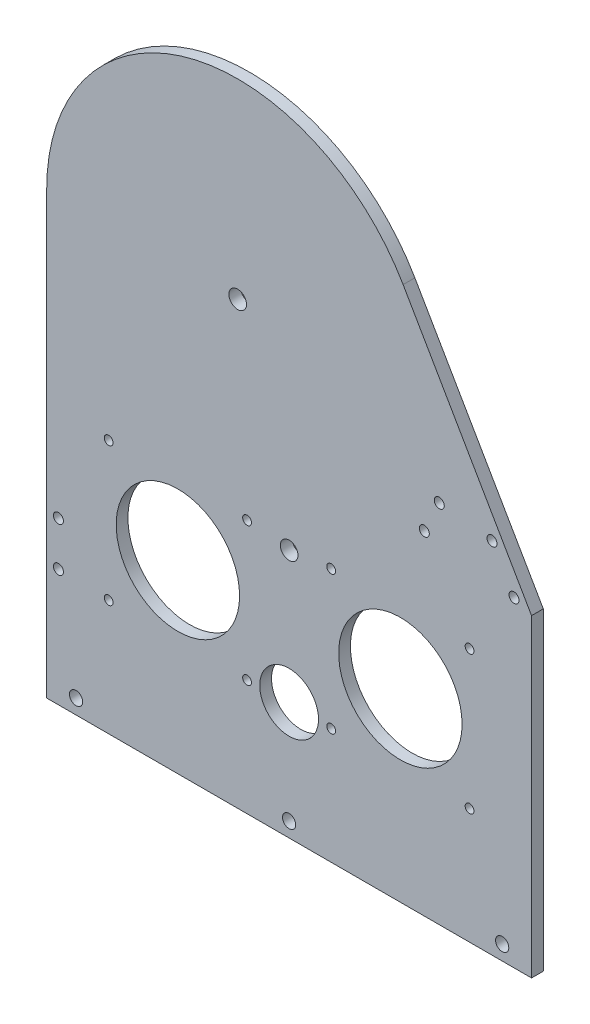
ISO-10303-21;
HEADER;
FILE_DESCRIPTION(('STEP AP214'),'2;1');
FILE_NAME('part.step','',(''),(''),'','','');
FILE_SCHEMA(('AUTOMOTIVE_DESIGN { 1 0 10303 214 1 1 1 1 }'));
ENDSEC;
DATA;
#1=APPLICATION_CONTEXT('core data for automotive mechanical design processes');
#2=APPLICATION_PROTOCOL_DEFINITION('international standard','automotive_design',2000,#1);
#3=PRODUCT_CONTEXT('',#1,'mechanical');
#4=PRODUCT('Part','Part','',(#3));
#5=PRODUCT_RELATED_PRODUCT_CATEGORY('part','',(#4));
#6=PRODUCT_DEFINITION_FORMATION('','',#4);
#7=PRODUCT_DEFINITION_CONTEXT('part definition',#1,'design');
#8=PRODUCT_DEFINITION('design','',#6,#7);
#9=PRODUCT_DEFINITION_SHAPE('','',#8);
#10=(LENGTH_UNIT() NAMED_UNIT(*) SI_UNIT(.MILLI.,.METRE.));
#11=(NAMED_UNIT(*) PLANE_ANGLE_UNIT() SI_UNIT($,.RADIAN.));
#12=(NAMED_UNIT(*) SI_UNIT($,.STERADIAN.) SOLID_ANGLE_UNIT());
#13=UNCERTAINTY_MEASURE_WITH_UNIT(LENGTH_MEASURE(1.E-05),#10,'distance_accuracy_value','');
#14=(GEOMETRIC_REPRESENTATION_CONTEXT(3) GLOBAL_UNCERTAINTY_ASSIGNED_CONTEXT((#13)) GLOBAL_UNIT_ASSIGNED_CONTEXT((#10,
#11,#12)) REPRESENTATION_CONTEXT('',''));
#15=CARTESIAN_POINT('',(0.,0.,0.));
#16=DIRECTION('',(0.,0.,1.));
#17=DIRECTION('',(1.,0.,0.));
#18=AXIS2_PLACEMENT_3D('',#15,#16,#17);
#19=CARTESIAN_POINT('',(65.,150.,4.));
#20=DIRECTION('',(0.,0.,1.));
#21=DIRECTION('',(1.,0.,0.));
#22=AXIS2_PLACEMENT_3D('',#19,#20,#21);
#23=PLANE('',#22);
#24=CARTESIAN_POINT('',(143.91,39.4079759479735,4.0000000000191));
#25=DIRECTION('',(0.,0.,1.));
#26=DIRECTION('',(1.,0.,0.));
#27=AXIS2_PLACEMENT_3D('',#24,#25,#26);
#28=CIRCLE('',#27,1.5);
#29=CARTESIAN_POINT('',(145.41,39.4079759479735,4.0000000000191));
#30=VERTEX_POINT('',#29);
#31=EDGE_CURVE('E437',#30,#30,#28,.T.);
#32=ORIENTED_EDGE('',*,*,#31,.F.);
#33=EDGE_LOOP('',(#32));
#34=FACE_BOUND('',#33,.T.);
#35=CARTESIAN_POINT('',(143.91,86.5079759479735,4.0000000000191));
#36=DIRECTION('',(0.,0.,1.));
#37=DIRECTION('',(1.,0.,0.));
#38=AXIS2_PLACEMENT_3D('',#35,#36,#37);
#39=CIRCLE('',#38,1.5);
#40=CARTESIAN_POINT('',(145.41,86.5079759479735,4.0000000000191));
#41=VERTEX_POINT('',#40);
#42=EDGE_CURVE('E439',#41,#41,#39,.T.);
#43=ORIENTED_EDGE('',*,*,#42,.F.);
#44=EDGE_LOOP('',(#43));
#45=FACE_BOUND('',#44,.T.);
#46=CARTESIAN_POINT('',(96.81,39.4079759479735,4.0000000000191));
#47=DIRECTION('',(0.,0.,1.));
#48=DIRECTION('',(1.,0.,0.));
#49=AXIS2_PLACEMENT_3D('',#46,#47,#48);
#50=CIRCLE('',#49,1.5);
#51=CARTESIAN_POINT('',(98.31,39.4079759479735,4.0000000000191));
#52=VERTEX_POINT('',#51);
#53=EDGE_CURVE('E447',#52,#52,#50,.T.);
#54=ORIENTED_EDGE('',*,*,#53,.F.);
#55=EDGE_LOOP('',(#54));
#56=FACE_BOUND('',#55,.T.);
#57=CARTESIAN_POINT('',(96.81,86.5079759479735,4.0000000000191));
#58=DIRECTION('',(0.,0.,1.));
#59=DIRECTION('',(1.,0.,0.));
#60=AXIS2_PLACEMENT_3D('',#57,#58,#59);
#61=CIRCLE('',#60,1.5);
#62=CARTESIAN_POINT('',(98.31,86.5079759479735,4.0000000000191));
#63=VERTEX_POINT('',#62);
#64=EDGE_CURVE('E453',#63,#63,#61,.T.);
#65=ORIENTED_EDGE('',*,*,#64,.F.);
#66=EDGE_LOOP('',(#65));
#67=FACE_BOUND('',#66,.T.);
#68=CARTESIAN_POINT('',(68.19,39.4079759479735,4.));
#69=DIRECTION('',(0.,0.,1.));
#70=DIRECTION('',(1.,0.,0.));
#71=AXIS2_PLACEMENT_3D('',#68,#69,#70);
#72=CIRCLE('',#71,1.5);
#73=CARTESIAN_POINT('',(69.69,39.4079759479735,4.));
#74=VERTEX_POINT('',#73);
#75=EDGE_CURVE('E459',#74,#74,#72,.T.);
#76=ORIENTED_EDGE('',*,*,#75,.F.);
#77=EDGE_LOOP('',(#76));
#78=FACE_BOUND('',#77,.T.);
#79=CARTESIAN_POINT('',(21.09,39.4079759479735,4.));
#80=DIRECTION('',(0.,0.,1.));
#81=DIRECTION('',(1.,0.,0.));
#82=AXIS2_PLACEMENT_3D('',#79,#80,#81);
#83=CIRCLE('',#82,1.5);
#84=CARTESIAN_POINT('',(22.59,39.4079759479735,4.));
#85=VERTEX_POINT('',#84);
#86=EDGE_CURVE('E465',#85,#85,#83,.T.);
#87=ORIENTED_EDGE('',*,*,#86,.F.);
#88=EDGE_LOOP('',(#87));
#89=FACE_BOUND('',#88,.T.);
#90=CARTESIAN_POINT('',(68.19,86.5079759479735,4.));
#91=DIRECTION('',(0.,0.,1.));
#92=DIRECTION('',(1.,0.,0.));
#93=AXIS2_PLACEMENT_3D('',#90,#91,#92);
#94=CIRCLE('',#93,1.5);
#95=CARTESIAN_POINT('',(69.69,86.5079759479735,4.));
#96=VERTEX_POINT('',#95);
#97=EDGE_CURVE('E471',#96,#96,#94,.T.);
#98=ORIENTED_EDGE('',*,*,#97,.F.);
#99=EDGE_LOOP('',(#98));
#100=FACE_BOUND('',#99,.T.);
#101=CARTESIAN_POINT('',(21.09,86.5079759479735,4.));
#102=DIRECTION('',(0.,0.,1.));
#103=DIRECTION('',(1.,0.,0.));
#104=AXIS2_PLACEMENT_3D('',#101,#102,#103);
#105=CIRCLE('',#104,1.5);
#106=CARTESIAN_POINT('',(22.59,86.5079759479735,4.));
#107=VERTEX_POINT('',#106);
#108=EDGE_CURVE('E477',#107,#107,#105,.T.);
#109=ORIENTED_EDGE('',*,*,#108,.F.);
#110=EDGE_LOOP('',(#109));
#111=FACE_BOUND('',#110,.T.);
#112=CARTESIAN_POINT('',(128.5,113.5,4.));
#113=DIRECTION('',(0.,0.,1.));
#114=DIRECTION('',(1.,0.,0.));
#115=AXIS2_PLACEMENT_3D('',#112,#113,#114);
#116=CIRCLE('',#115,1.70000000000001);
#117=CARTESIAN_POINT('',(130.2,113.5,4.));
#118=VERTEX_POINT('',#117);
#119=EDGE_CURVE('E170',#118,#118,#116,.T.);
#120=ORIENTED_EDGE('',*,*,#119,.F.);
#121=EDGE_LOOP('',(#120));
#122=FACE_BOUND('',#121,.T.);
#123=CARTESIAN_POINT('',(151.537549630851,122.112567276853,4.));
#124=DIRECTION('',(0.,0.,1.));
#125=DIRECTION('',(1.,0.,0.));
#126=AXIS2_PLACEMENT_3D('',#123,#124,#125);
#127=CIRCLE('',#126,1.70000000000001);
#128=CARTESIAN_POINT('',(153.237549630851,122.112567276853,4.));
#129=VERTEX_POINT('',#128);
#130=EDGE_CURVE('E186',#129,#129,#127,.T.);
#131=ORIENTED_EDGE('',*,*,#130,.F.);
#132=EDGE_LOOP('',(#131));
#133=FACE_BOUND('',#132,.T.);
#134=CARTESIAN_POINT('',(44.64,62.9579759479735,4.));
#135=DIRECTION('',(0.,0.,1.));
#136=DIRECTION('',(1.,0.,0.));
#137=AXIS2_PLACEMENT_3D('',#134,#135,#136);
#138=CIRCLE('',#137,21.);
#139=CARTESIAN_POINT('',(65.64,62.9579759479735,4.));
#140=VERTEX_POINT('',#139);
#141=EDGE_CURVE('E196',#140,#140,#138,.T.);
#142=ORIENTED_EDGE('',*,*,#141,.F.);
#143=EDGE_LOOP('',(#142));
#144=FACE_BOUND('',#143,.T.);
#145=CARTESIAN_POINT('',(4.,55.,4.));
#146=DIRECTION('',(0.,0.,1.));
#147=DIRECTION('',(1.,0.,0.));
#148=AXIS2_PLACEMENT_3D('',#145,#146,#147);
#149=CIRCLE('',#148,1.7);
#150=CARTESIAN_POINT('',(5.7,55.,4.));
#151=VERTEX_POINT('',#150);
#152=EDGE_CURVE('E206',#151,#151,#149,.T.);
#153=ORIENTED_EDGE('',*,*,#152,.F.);
#154=EDGE_LOOP('',(#153));
#155=FACE_BOUND('',#154,.T.);
#156=CARTESIAN_POINT('',(155.,5.,4.));
#157=DIRECTION('',(0.,0.,1.));
#158=DIRECTION('',(1.,0.,0.));
#159=AXIS2_PLACEMENT_3D('',#156,#157,#158);
#160=CIRCLE('',#159,2.25000000000001);
#161=CARTESIAN_POINT('',(157.25,5.,4.));
#162=VERTEX_POINT('',#161);
#163=EDGE_CURVE('E216',#162,#162,#160,.T.);
#164=ORIENTED_EDGE('',*,*,#163,.F.);
#165=EDGE_LOOP('',(#164));
#166=FACE_BOUND('',#165,.T.);
#167=CARTESIAN_POINT('',(82.5,5.,4.));
#168=DIRECTION('',(0.,0.,1.));
#169=DIRECTION('',(1.,0.,0.));
#170=AXIS2_PLACEMENT_3D('',#167,#168,#169);
#171=CIRCLE('',#170,2.25);
#172=CARTESIAN_POINT('',(84.75,5.,4.));
#173=VERTEX_POINT('',#172);
#174=EDGE_CURVE('E226',#173,#173,#171,.T.);
#175=ORIENTED_EDGE('',*,*,#174,.F.);
#176=EDGE_LOOP('',(#175));
#177=FACE_BOUND('',#176,.T.);
#178=CARTESIAN_POINT('',(65.,150.,4.));
#179=DIRECTION('',(0.,0.,1.));
#180=DIRECTION('',(1.,0.,0.));
#181=AXIS2_PLACEMENT_3D('',#178,#179,#180);
#182=CIRCLE('',#181,3.00000000000001);
#183=CARTESIAN_POINT('',(68.,150.,4.));
#184=VERTEX_POINT('',#183);
#185=EDGE_CURVE('E101',#184,#184,#182,.T.);
#186=ORIENTED_EDGE('',*,*,#185,.F.);
#187=EDGE_LOOP('',(#186));
#188=FACE_BOUND('',#187,.T.);
#189=DIRECTION('',(0.,1.,0.));
#190=VECTOR('',#189,1.);
#191=CARTESIAN_POINT('',(0.,0.,4.));
#192=LINE('',#191,#190);
#193=CARTESIAN_POINT('',(0.,0.,4.));
#194=VERTEX_POINT('',#193);
#195=CARTESIAN_POINT('',(0.,150.,4.));
#196=VERTEX_POINT('',#195);
#197=EDGE_CURVE('E84',#194,#196,#192,.T.);
#198=ORIENTED_EDGE('',*,*,#197,.F.);
#199=DIRECTION('',(1.,0.,0.));
#200=VECTOR('',#199,1.);
#201=CARTESIAN_POINT('',(0.,0.,4.));
#202=LINE('',#201,#200);
#203=CARTESIAN_POINT('',(165.,0.,4.));
#204=VERTEX_POINT('',#203);
#205=EDGE_CURVE('E57',#194,#204,#202,.T.);
#206=ORIENTED_EDGE('',*,*,#205,.T.);
#207=DIRECTION('',(0.,1.,0.));
#208=VECTOR('',#207,1.);
#209=CARTESIAN_POINT('',(165.,0.,4.));
#210=LINE('',#209,#208);
#211=CARTESIAN_POINT('',(165.,106.794919243111,4.));
#212=VERTEX_POINT('',#211);
#213=EDGE_CURVE('E119',#204,#212,#210,.T.);
#214=ORIENTED_EDGE('',*,*,#213,.T.);
#215=DIRECTION('',(0.499999999999995,-0.866025403784441,0.));
#216=VECTOR('',#215,1.);
#217=CARTESIAN_POINT('',(121.291651245989,182.5,4.));
#218=LINE('',#217,#216);
#219=CARTESIAN_POINT('',(121.291651245989,182.5,4.));
#220=VERTEX_POINT('',#219);
#221=EDGE_CURVE('E116',#220,#212,#218,.T.);
#222=ORIENTED_EDGE('',*,*,#221,.F.);
#223=CARTESIAN_POINT('',(65.,150.,4.));
#224=DIRECTION('',(0.,0.,1.));
#225=DIRECTION('',(1.,0.,0.));
#226=AXIS2_PLACEMENT_3D('',#223,#224,#225);
#227=CIRCLE('',#226,65.);
#228=EDGE_CURVE('E114',#220,#196,#227,.T.);
#229=ORIENTED_EDGE('',*,*,#228,.T.);
#230=EDGE_LOOP('',(#198,#206,#214,#222,#229));
#231=FACE_BOUND('',#230,.T.);
#232=CARTESIAN_POINT('',(82.5,40.,4.));
#233=DIRECTION('',(0.,0.,1.));
#234=DIRECTION('',(1.,0.,0.));
#235=AXIS2_PLACEMENT_3D('',#232,#233,#234);
#236=CIRCLE('',#235,9.99999999999999);
#237=CARTESIAN_POINT('',(92.5,40.,4.));
#238=VERTEX_POINT('',#237);
#239=EDGE_CURVE('E141',#238,#238,#236,.T.);
#240=ORIENTED_EDGE('',*,*,#239,.F.);
#241=EDGE_LOOP('',(#240));
#242=FACE_BOUND('',#241,.T.);
#243=CARTESIAN_POINT('',(9.99999999999999,5.,4.));
#244=DIRECTION('',(0.,0.,1.));
#245=DIRECTION('',(1.,0.,0.));
#246=AXIS2_PLACEMENT_3D('',#243,#244,#245);
#247=CIRCLE('',#246,2.25);
#248=CARTESIAN_POINT('',(12.25,5.,4.));
#249=VERTEX_POINT('',#248);
#250=EDGE_CURVE('E145',#249,#249,#247,.T.);
#251=ORIENTED_EDGE('',*,*,#250,.F.);
#252=EDGE_LOOP('',(#251));
#253=FACE_BOUND('',#252,.T.);
#254=CARTESIAN_POINT('',(4.,40.,4.));
#255=DIRECTION('',(0.,0.,1.));
#256=DIRECTION('',(1.,0.,0.));
#257=AXIS2_PLACEMENT_3D('',#254,#255,#256);
#258=CIRCLE('',#257,1.7);
#259=CARTESIAN_POINT('',(5.7,40.,4.));
#260=VERTEX_POINT('',#259);
#261=EDGE_CURVE('E149',#260,#260,#258,.T.);
#262=ORIENTED_EDGE('',*,*,#261,.F.);
#263=EDGE_LOOP('',(#262));
#264=FACE_BOUND('',#263,.T.);
#265=CARTESIAN_POINT('',(82.5,84.8079759479735,4.));
#266=DIRECTION('',(0.,0.,1.));
#267=DIRECTION('',(1.,0.,0.));
#268=AXIS2_PLACEMENT_3D('',#265,#266,#267);
#269=CIRCLE('',#268,3.00000000000001);
#270=CARTESIAN_POINT('',(85.5,84.8079759479735,4.));
#271=VERTEX_POINT('',#270);
#272=EDGE_CURVE('E153',#271,#271,#269,.T.);
#273=ORIENTED_EDGE('',*,*,#272,.F.);
#274=EDGE_LOOP('',(#273));
#275=FACE_BOUND('',#274,.T.);
#276=CARTESIAN_POINT('',(120.36,62.9579759479735,4.));
#277=DIRECTION('',(0.,0.,1.));
#278=DIRECTION('',(1.,0.,0.));
#279=AXIS2_PLACEMENT_3D('',#276,#277,#278);
#280=CIRCLE('',#279,21.);
#281=CARTESIAN_POINT('',(141.36,62.9579759479735,4.));
#282=VERTEX_POINT('',#281);
#283=EDGE_CURVE('E157',#282,#282,#280,.T.);
#284=ORIENTED_EDGE('',*,*,#283,.F.);
#285=EDGE_LOOP('',(#284));
#286=FACE_BOUND('',#285,.T.);
#287=CARTESIAN_POINT('',(159.037549630851,109.122186220086,4.));
#288=DIRECTION('',(0.,0.,1.));
#289=DIRECTION('',(1.,0.,0.));
#290=AXIS2_PLACEMENT_3D('',#287,#288,#289);
#291=CIRCLE('',#290,1.70000000000001);
#292=CARTESIAN_POINT('',(160.737549630851,109.122186220086,4.));
#293=VERTEX_POINT('',#292);
#294=EDGE_CURVE('E161',#293,#293,#291,.T.);
#295=ORIENTED_EDGE('',*,*,#294,.F.);
#296=EDGE_LOOP('',(#295));
#297=FACE_BOUND('',#296,.T.);
#298=CARTESIAN_POINT('',(133.6,124.3,4.));
#299=DIRECTION('',(0.,0.,1.));
#300=DIRECTION('',(1.,0.,0.));
#301=AXIS2_PLACEMENT_3D('',#298,#299,#300);
#302=CIRCLE('',#301,1.70000000000001);
#303=CARTESIAN_POINT('',(135.3,124.3,4.));
#304=VERTEX_POINT('',#303);
#305=EDGE_CURVE('E164',#304,#304,#302,.T.);
#306=ORIENTED_EDGE('',*,*,#305,.F.);
#307=EDGE_LOOP('',(#306));
#308=FACE_BOUND('',#307,.T.);
#309=ADVANCED_FACE('F35',(#34,#45,#56,#67,#78,#89,#100,#111,#122,#133,#144,#155,#166,#177,#188,
#231,#242,#253,#264,#275,#286,#297,#308),#23,.T.);
#310=CARTESIAN_POINT('',(65.,150.,0.));
#311=DIRECTION('',(0.,0.,1.));
#312=DIRECTION('',(1.,0.,0.));
#313=AXIS2_PLACEMENT_3D('',#310,#311,#312);
#314=PLANE('',#313);
#315=CARTESIAN_POINT('',(143.91,39.4079759479735,0.));
#316=DIRECTION('',(0.,0.,1.));
#317=DIRECTION('',(1.,0.,0.));
#318=AXIS2_PLACEMENT_3D('',#315,#316,#317);
#319=CIRCLE('',#318,1.5);
#320=CARTESIAN_POINT('',(145.41,39.4079759479735,0.));
#321=VERTEX_POINT('',#320);
#322=EDGE_CURVE('E434',#321,#321,#319,.T.);
#323=ORIENTED_EDGE('',*,*,#322,.T.);
#324=EDGE_LOOP('',(#323));
#325=FACE_BOUND('',#324,.T.);
#326=CARTESIAN_POINT('',(143.91,86.5079759479735,0.));
#327=DIRECTION('',(0.,0.,1.));
#328=DIRECTION('',(1.,0.,0.));
#329=AXIS2_PLACEMENT_3D('',#326,#327,#328);
#330=CIRCLE('',#329,1.5);
#331=CARTESIAN_POINT('',(145.41,86.5079759479735,0.));
#332=VERTEX_POINT('',#331);
#333=EDGE_CURVE('E444',#332,#332,#330,.T.);
#334=ORIENTED_EDGE('',*,*,#333,.T.);
#335=EDGE_LOOP('',(#334));
#336=FACE_BOUND('',#335,.T.);
#337=CARTESIAN_POINT('',(96.81,39.4079759479735,0.));
#338=DIRECTION('',(0.,0.,1.));
#339=DIRECTION('',(1.,0.,0.));
#340=AXIS2_PLACEMENT_3D('',#337,#338,#339);
#341=CIRCLE('',#340,1.5);
#342=CARTESIAN_POINT('',(98.31,39.4079759479735,0.));
#343=VERTEX_POINT('',#342);
#344=EDGE_CURVE('E450',#343,#343,#341,.T.);
#345=ORIENTED_EDGE('',*,*,#344,.T.);
#346=EDGE_LOOP('',(#345));
#347=FACE_BOUND('',#346,.T.);
#348=CARTESIAN_POINT('',(96.81,86.5079759479735,0.));
#349=DIRECTION('',(0.,0.,1.));
#350=DIRECTION('',(1.,0.,0.));
#351=AXIS2_PLACEMENT_3D('',#348,#349,#350);
#352=CIRCLE('',#351,1.5);
#353=CARTESIAN_POINT('',(98.31,86.5079759479735,0.));
#354=VERTEX_POINT('',#353);
#355=EDGE_CURVE('E456',#354,#354,#352,.T.);
#356=ORIENTED_EDGE('',*,*,#355,.T.);
#357=EDGE_LOOP('',(#356));
#358=FACE_BOUND('',#357,.T.);
#359=CARTESIAN_POINT('',(68.19,39.4079759479735,0.));
#360=DIRECTION('',(0.,0.,1.));
#361=DIRECTION('',(1.,0.,0.));
#362=AXIS2_PLACEMENT_3D('',#359,#360,#361);
#363=CIRCLE('',#362,1.5);
#364=CARTESIAN_POINT('',(69.69,39.4079759479735,0.));
#365=VERTEX_POINT('',#364);
#366=EDGE_CURVE('E462',#365,#365,#363,.T.);
#367=ORIENTED_EDGE('',*,*,#366,.T.);
#368=EDGE_LOOP('',(#367));
#369=FACE_BOUND('',#368,.T.);
#370=CARTESIAN_POINT('',(21.09,39.4079759479735,0.));
#371=DIRECTION('',(0.,0.,1.));
#372=DIRECTION('',(1.,0.,0.));
#373=AXIS2_PLACEMENT_3D('',#370,#371,#372);
#374=CIRCLE('',#373,1.5);
#375=CARTESIAN_POINT('',(22.59,39.4079759479735,0.));
#376=VERTEX_POINT('',#375);
#377=EDGE_CURVE('E468',#376,#376,#374,.T.);
#378=ORIENTED_EDGE('',*,*,#377,.T.);
#379=EDGE_LOOP('',(#378));
#380=FACE_BOUND('',#379,.T.);
#381=CARTESIAN_POINT('',(68.19,86.5079759479735,0.));
#382=DIRECTION('',(0.,0.,1.));
#383=DIRECTION('',(1.,0.,0.));
#384=AXIS2_PLACEMENT_3D('',#381,#382,#383);
#385=CIRCLE('',#384,1.5);
#386=CARTESIAN_POINT('',(69.69,86.5079759479735,0.));
#387=VERTEX_POINT('',#386);
#388=EDGE_CURVE('E474',#387,#387,#385,.T.);
#389=ORIENTED_EDGE('',*,*,#388,.T.);
#390=EDGE_LOOP('',(#389));
#391=FACE_BOUND('',#390,.T.);
#392=CARTESIAN_POINT('',(21.09,86.5079759479735,0.));
#393=DIRECTION('',(0.,0.,1.));
#394=DIRECTION('',(1.,0.,0.));
#395=AXIS2_PLACEMENT_3D('',#392,#393,#394);
#396=CIRCLE('',#395,1.5);
#397=CARTESIAN_POINT('',(22.59,86.5079759479735,0.));
#398=VERTEX_POINT('',#397);
#399=EDGE_CURVE('E173',#398,#398,#396,.T.);
#400=ORIENTED_EDGE('',*,*,#399,.T.);
#401=EDGE_LOOP('',(#400));
#402=FACE_BOUND('',#401,.T.);
#403=CARTESIAN_POINT('',(128.5,113.5,0.));
#404=DIRECTION('',(0.,0.,1.));
#405=DIRECTION('',(1.,0.,0.));
#406=AXIS2_PLACEMENT_3D('',#403,#404,#405);
#407=CIRCLE('',#406,1.70000000000001);
#408=CARTESIAN_POINT('',(130.2,113.5,0.));
#409=VERTEX_POINT('',#408);
#410=EDGE_CURVE('E166',#409,#409,#407,.T.);
#411=ORIENTED_EDGE('',*,*,#410,.T.);
#412=EDGE_LOOP('',(#411));
#413=FACE_BOUND('',#412,.T.);
#414=CARTESIAN_POINT('',(151.537549630851,122.112567276853,0.));
#415=DIRECTION('',(0.,0.,1.));
#416=DIRECTION('',(1.,0.,0.));
#417=AXIS2_PLACEMENT_3D('',#414,#415,#416);
#418=CIRCLE('',#417,1.70000000000001);
#419=CARTESIAN_POINT('',(153.237549630851,122.112567276853,0.));
#420=VERTEX_POINT('',#419);
#421=EDGE_CURVE('E183',#420,#420,#418,.T.);
#422=ORIENTED_EDGE('',*,*,#421,.T.);
#423=EDGE_LOOP('',(#422));
#424=FACE_BOUND('',#423,.T.);
#425=CARTESIAN_POINT('',(44.64,62.9579759479735,0.));
#426=DIRECTION('',(0.,0.,1.));
#427=DIRECTION('',(1.,0.,0.));
#428=AXIS2_PLACEMENT_3D('',#425,#426,#427);
#429=CIRCLE('',#428,21.);
#430=CARTESIAN_POINT('',(65.64,62.9579759479735,0.));
#431=VERTEX_POINT('',#430);
#432=EDGE_CURVE('E193',#431,#431,#429,.T.);
#433=ORIENTED_EDGE('',*,*,#432,.T.);
#434=EDGE_LOOP('',(#433));
#435=FACE_BOUND('',#434,.T.);
#436=CARTESIAN_POINT('',(4.,55.,0.));
#437=DIRECTION('',(0.,0.,1.));
#438=DIRECTION('',(1.,0.,0.));
#439=AXIS2_PLACEMENT_3D('',#436,#437,#438);
#440=CIRCLE('',#439,1.7);
#441=CARTESIAN_POINT('',(5.7,55.,0.));
#442=VERTEX_POINT('',#441);
#443=EDGE_CURVE('E203',#442,#442,#440,.T.);
#444=ORIENTED_EDGE('',*,*,#443,.T.);
#445=EDGE_LOOP('',(#444));
#446=FACE_BOUND('',#445,.T.);
#447=CARTESIAN_POINT('',(155.,5.,0.));
#448=DIRECTION('',(0.,0.,1.));
#449=DIRECTION('',(1.,0.,0.));
#450=AXIS2_PLACEMENT_3D('',#447,#448,#449);
#451=CIRCLE('',#450,2.25000000000001);
#452=CARTESIAN_POINT('',(157.25,5.,0.));
#453=VERTEX_POINT('',#452);
#454=EDGE_CURVE('E213',#453,#453,#451,.T.);
#455=ORIENTED_EDGE('',*,*,#454,.T.);
#456=EDGE_LOOP('',(#455));
#457=FACE_BOUND('',#456,.T.);
#458=CARTESIAN_POINT('',(82.5,5.,0.));
#459=DIRECTION('',(0.,0.,1.));
#460=DIRECTION('',(1.,0.,0.));
#461=AXIS2_PLACEMENT_3D('',#458,#459,#460);
#462=CIRCLE('',#461,2.25);
#463=CARTESIAN_POINT('',(84.75,5.,0.));
#464=VERTEX_POINT('',#463);
#465=EDGE_CURVE('E223',#464,#464,#462,.T.);
#466=ORIENTED_EDGE('',*,*,#465,.T.);
#467=EDGE_LOOP('',(#466));
#468=FACE_BOUND('',#467,.T.);
#469=CARTESIAN_POINT('',(65.,150.,0.));
#470=DIRECTION('',(0.,0.,1.));
#471=DIRECTION('',(1.,0.,0.));
#472=AXIS2_PLACEMENT_3D('',#469,#470,#471);
#473=CIRCLE('',#472,3.00000000000001);
#474=CARTESIAN_POINT('',(68.,150.,0.));
#475=VERTEX_POINT('',#474);
#476=EDGE_CURVE('E104',#475,#475,#473,.T.);
#477=ORIENTED_EDGE('',*,*,#476,.T.);
#478=EDGE_LOOP('',(#477));
#479=FACE_BOUND('',#478,.T.);
#480=DIRECTION('',(0.,1.,0.));
#481=VECTOR('',#480,1.);
#482=CARTESIAN_POINT('',(0.,0.,0.));
#483=LINE('',#482,#481);
#484=CARTESIAN_POINT('',(0.,0.,0.));
#485=VERTEX_POINT('',#484);
#486=CARTESIAN_POINT('',(0.,150.,0.));
#487=VERTEX_POINT('',#486);
#488=EDGE_CURVE('E83',#485,#487,#483,.T.);
#489=ORIENTED_EDGE('',*,*,#488,.T.);
#490=CARTESIAN_POINT('',(65.,150.,0.));
#491=DIRECTION('',(0.,0.,1.));
#492=DIRECTION('',(1.,0.,0.));
#493=AXIS2_PLACEMENT_3D('',#490,#491,#492);
#494=CIRCLE('',#493,65.);
#495=CARTESIAN_POINT('',(121.291651245989,182.5,0.));
#496=VERTEX_POINT('',#495);
#497=EDGE_CURVE('E89',#496,#487,#494,.T.);
#498=ORIENTED_EDGE('',*,*,#497,.F.);
#499=DIRECTION('',(0.499999999999995,-0.866025403784441,0.));
#500=VECTOR('',#499,1.);
#501=CARTESIAN_POINT('',(121.291651245989,182.5,0.));
#502=LINE('',#501,#500);
#503=CARTESIAN_POINT('',(165.,106.794919243111,0.));
#504=VERTEX_POINT('',#503);
#505=EDGE_CURVE('E94',#496,#504,#502,.T.);
#506=ORIENTED_EDGE('',*,*,#505,.T.);
#507=DIRECTION('',(0.,1.,0.));
#508=VECTOR('',#507,1.);
#509=CARTESIAN_POINT('',(165.,0.,0.));
#510=LINE('',#509,#508);
#511=CARTESIAN_POINT('',(165.,0.,0.));
#512=VERTEX_POINT('',#511);
#513=EDGE_CURVE('E109',#512,#504,#510,.T.);
#514=ORIENTED_EDGE('',*,*,#513,.F.);
#515=DIRECTION('',(1.,0.,0.));
#516=VECTOR('',#515,1.);
#517=CARTESIAN_POINT('',(0.,0.,0.));
#518=LINE('',#517,#516);
#519=EDGE_CURVE('E100',#485,#512,#518,.T.);
#520=ORIENTED_EDGE('',*,*,#519,.F.);
#521=EDGE_LOOP('',(#489,#498,#506,#514,#520));
#522=FACE_BOUND('',#521,.T.);
#523=CARTESIAN_POINT('',(82.5,40.,0.));
#524=DIRECTION('',(0.,0.,1.));
#525=DIRECTION('',(1.,0.,0.));
#526=AXIS2_PLACEMENT_3D('',#523,#524,#525);
#527=CIRCLE('',#526,9.99999999999999);
#528=CARTESIAN_POINT('',(92.5,40.,0.));
#529=VERTEX_POINT('',#528);
#530=EDGE_CURVE('E229',#529,#529,#527,.T.);
#531=ORIENTED_EDGE('',*,*,#530,.T.);
#532=EDGE_LOOP('',(#531));
#533=FACE_BOUND('',#532,.T.);
#534=CARTESIAN_POINT('',(9.99999999999999,5.,0.));
#535=DIRECTION('',(0.,0.,1.));
#536=DIRECTION('',(1.,0.,0.));
#537=AXIS2_PLACEMENT_3D('',#534,#535,#536);
#538=CIRCLE('',#537,2.25);
#539=CARTESIAN_POINT('',(12.25,5.,0.));
#540=VERTEX_POINT('',#539);
#541=EDGE_CURVE('E219',#540,#540,#538,.T.);
#542=ORIENTED_EDGE('',*,*,#541,.T.);
#543=EDGE_LOOP('',(#542));
#544=FACE_BOUND('',#543,.T.);
#545=CARTESIAN_POINT('',(4.,40.,0.));
#546=DIRECTION('',(0.,0.,1.));
#547=DIRECTION('',(1.,0.,0.));
#548=AXIS2_PLACEMENT_3D('',#545,#546,#547);
#549=CIRCLE('',#548,1.7);
#550=CARTESIAN_POINT('',(5.7,40.,0.));
#551=VERTEX_POINT('',#550);
#552=EDGE_CURVE('E209',#551,#551,#549,.T.);
#553=ORIENTED_EDGE('',*,*,#552,.T.);
#554=EDGE_LOOP('',(#553));
#555=FACE_BOUND('',#554,.T.);
#556=CARTESIAN_POINT('',(82.5,84.8079759479735,0.));
#557=DIRECTION('',(0.,0.,1.));
#558=DIRECTION('',(1.,0.,0.));
#559=AXIS2_PLACEMENT_3D('',#556,#557,#558);
#560=CIRCLE('',#559,3.00000000000001);
#561=CARTESIAN_POINT('',(85.5,84.8079759479735,0.));
#562=VERTEX_POINT('',#561);
#563=EDGE_CURVE('E199',#562,#562,#560,.T.);
#564=ORIENTED_EDGE('',*,*,#563,.T.);
#565=EDGE_LOOP('',(#564));
#566=FACE_BOUND('',#565,.T.);
#567=CARTESIAN_POINT('',(120.36,62.9579759479735,0.));
#568=DIRECTION('',(0.,0.,1.));
#569=DIRECTION('',(1.,0.,0.));
#570=AXIS2_PLACEMENT_3D('',#567,#568,#569);
#571=CIRCLE('',#570,21.);
#572=CARTESIAN_POINT('',(141.36,62.9579759479735,0.));
#573=VERTEX_POINT('',#572);
#574=EDGE_CURVE('E189',#573,#573,#571,.T.);
#575=ORIENTED_EDGE('',*,*,#574,.T.);
#576=EDGE_LOOP('',(#575));
#577=FACE_BOUND('',#576,.T.);
#578=CARTESIAN_POINT('',(159.037549630851,109.122186220086,0.));
#579=DIRECTION('',(0.,0.,1.));
#580=DIRECTION('',(1.,0.,0.));
#581=AXIS2_PLACEMENT_3D('',#578,#579,#580);
#582=CIRCLE('',#581,1.70000000000001);
#583=CARTESIAN_POINT('',(160.737549630851,109.122186220086,0.));
#584=VERTEX_POINT('',#583);
#585=EDGE_CURVE('E179',#584,#584,#582,.T.);
#586=ORIENTED_EDGE('',*,*,#585,.T.);
#587=EDGE_LOOP('',(#586));
#588=FACE_BOUND('',#587,.T.);
#589=CARTESIAN_POINT('',(133.6,124.3,0.));
#590=DIRECTION('',(0.,0.,1.));
#591=DIRECTION('',(1.,0.,0.));
#592=AXIS2_PLACEMENT_3D('',#589,#590,#591);
#593=CIRCLE('',#592,1.70000000000001);
#594=CARTESIAN_POINT('',(135.3,124.3,0.));
#595=VERTEX_POINT('',#594);
#596=EDGE_CURVE('E167',#595,#595,#593,.T.);
#597=ORIENTED_EDGE('',*,*,#596,.T.);
#598=EDGE_LOOP('',(#597));
#599=FACE_BOUND('',#598,.T.);
#600=ADVANCED_FACE('F97',(#325,#336,#347,#358,#369,#380,#391,#402,#413,#424,#435,#446,#457,#468,
#479,#522,#533,#544,#555,#566,#577,#588,#599),#314,.F.);
#601=CARTESIAN_POINT('',(0.,0.,4.));
#602=DIRECTION('',(-1.,0.,0.));
#603=DIRECTION('',(0.,0.,1.));
#604=AXIS2_PLACEMENT_3D('',#601,#602,#603);
#605=PLANE('',#604);
#606=ORIENTED_EDGE('',*,*,#488,.F.);
#607=DIRECTION('',(0.,0.,-1.));
#608=VECTOR('',#607,1.);
#609=CARTESIAN_POINT('',(0.,0.,4.));
#610=LINE('',#609,#608);
#611=EDGE_CURVE('E11',#194,#485,#610,.T.);
#612=ORIENTED_EDGE('',*,*,#611,.F.);
#613=ORIENTED_EDGE('',*,*,#197,.T.);
#614=DIRECTION('',(0.,0.,-1.));
#615=VECTOR('',#614,1.);
#616=CARTESIAN_POINT('',(0.,150.,4.));
#617=LINE('',#616,#615);
#618=EDGE_CURVE('E39',#196,#487,#617,.T.);
#619=ORIENTED_EDGE('',*,*,#618,.T.);
#620=EDGE_LOOP('',(#606,#612,#613,#619));
#621=FACE_BOUND('',#620,.T.);
#622=ADVANCED_FACE('F37',(#621),#605,.T.);
#623=CARTESIAN_POINT('',(0.,0.,4.));
#624=DIRECTION('',(0.,1.,0.));
#625=DIRECTION('',(0.,0.,1.));
#626=AXIS2_PLACEMENT_3D('',#623,#624,#625);
#627=PLANE('',#626);
#628=ORIENTED_EDGE('',*,*,#519,.T.);
#629=DIRECTION('',(0.,0.,-1.));
#630=VECTOR('',#629,1.);
#631=CARTESIAN_POINT('',(165.,0.,4.));
#632=LINE('',#631,#630);
#633=EDGE_CURVE('E44',#204,#512,#632,.T.);
#634=ORIENTED_EDGE('',*,*,#633,.F.);
#635=ORIENTED_EDGE('',*,*,#205,.F.);
#636=ORIENTED_EDGE('',*,*,#611,.T.);
#637=EDGE_LOOP('',(#628,#634,#635,#636));
#638=FACE_BOUND('',#637,.T.);
#639=ADVANCED_FACE('F133',(#638),#627,.F.);
#640=CARTESIAN_POINT('',(165.,0.,4.));
#641=DIRECTION('',(-1.,0.,0.));
#642=DIRECTION('',(0.,-1.,0.));
#643=AXIS2_PLACEMENT_3D('',#640,#641,#642);
#644=PLANE('',#643);
#645=ORIENTED_EDGE('',*,*,#513,.T.);
#646=DIRECTION('',(0.,0.,-1.));
#647=VECTOR('',#646,1.);
#648=CARTESIAN_POINT('',(165.,106.794919243111,4.));
#649=LINE('',#648,#647);
#650=EDGE_CURVE('E124',#212,#504,#649,.T.);
#651=ORIENTED_EDGE('',*,*,#650,.F.);
#652=ORIENTED_EDGE('',*,*,#213,.F.);
#653=ORIENTED_EDGE('',*,*,#633,.T.);
#654=EDGE_LOOP('',(#645,#651,#652,#653));
#655=FACE_BOUND('',#654,.T.);
#656=ADVANCED_FACE('F131',(#655),#644,.F.);
#657=CARTESIAN_POINT('',(121.291651245989,182.5,4.));
#658=DIRECTION('',(0.866025403784441,0.499999999999995,0.));
#659=DIRECTION('',(-0.499999999999995,0.866025403784442,0.));
#660=AXIS2_PLACEMENT_3D('',#657,#658,#659);
#661=PLANE('',#660);
#662=ORIENTED_EDGE('',*,*,#505,.F.);
#663=DIRECTION('',(0.,0.,-1.));
#664=VECTOR('',#663,1.);
#665=CARTESIAN_POINT('',(121.291651245989,182.5,4.));
#666=LINE('',#665,#664);
#667=EDGE_CURVE('E87',#220,#496,#666,.T.);
#668=ORIENTED_EDGE('',*,*,#667,.F.);
#669=ORIENTED_EDGE('',*,*,#221,.T.);
#670=ORIENTED_EDGE('',*,*,#650,.T.);
#671=EDGE_LOOP('',(#662,#668,#669,#670));
#672=FACE_BOUND('',#671,.T.);
#673=ADVANCED_FACE('F127',(#672),#661,.T.);
#674=CARTESIAN_POINT('',(65.,150.,4.));
#675=DIRECTION('',(0.,0.,-1.));
#676=DIRECTION('',(-1.,0.,0.));
#677=AXIS2_PLACEMENT_3D('',#674,#675,#676);
#678=CYLINDRICAL_SURFACE('',#677,65.);
#679=ORIENTED_EDGE('',*,*,#497,.T.);
#680=ORIENTED_EDGE('',*,*,#618,.F.);
#681=ORIENTED_EDGE('',*,*,#228,.F.);
#682=ORIENTED_EDGE('',*,*,#667,.T.);
#683=EDGE_LOOP('',(#679,#680,#681,#682));
#684=FACE_BOUND('',#683,.T.);
#685=ADVANCED_FACE('F90',(#684),#678,.T.);
#686=CARTESIAN_POINT('',(65.,150.,4.));
#687=DIRECTION('',(0.,0.,-1.));
#688=DIRECTION('',(-1.,0.,0.));
#689=AXIS2_PLACEMENT_3D('',#686,#687,#688);
#690=CYLINDRICAL_SURFACE('',#689,3.00000000000001);
#691=ORIENTED_EDGE('',*,*,#185,.T.);
#692=EDGE_LOOP('',(#691));
#693=FACE_BOUND('',#692,.T.);
#694=ORIENTED_EDGE('',*,*,#476,.F.);
#695=EDGE_LOOP('',(#694));
#696=FACE_BOUND('',#695,.T.);
#697=ADVANCED_FACE('F236',(#693,#696),#690,.F.);
#698=CARTESIAN_POINT('',(82.5,40.,4.));
#699=DIRECTION('',(0.,0.,-1.));
#700=DIRECTION('',(-1.,0.,0.));
#701=AXIS2_PLACEMENT_3D('',#698,#699,#700);
#702=CYLINDRICAL_SURFACE('',#701,9.99999999999999);
#703=ORIENTED_EDGE('',*,*,#239,.T.);
#704=EDGE_LOOP('',(#703));
#705=FACE_BOUND('',#704,.T.);
#706=ORIENTED_EDGE('',*,*,#530,.F.);
#707=EDGE_LOOP('',(#706));
#708=FACE_BOUND('',#707,.T.);
#709=ADVANCED_FACE('F238',(#705,#708),#702,.F.);
#710=CARTESIAN_POINT('',(82.5,5.,4.));
#711=DIRECTION('',(0.,0.,-1.));
#712=DIRECTION('',(-1.,0.,0.));
#713=AXIS2_PLACEMENT_3D('',#710,#711,#712);
#714=CYLINDRICAL_SURFACE('',#713,2.25);
#715=ORIENTED_EDGE('',*,*,#174,.T.);
#716=EDGE_LOOP('',(#715));
#717=FACE_BOUND('',#716,.T.);
#718=ORIENTED_EDGE('',*,*,#465,.F.);
#719=EDGE_LOOP('',(#718));
#720=FACE_BOUND('',#719,.T.);
#721=ADVANCED_FACE('F245',(#717,#720),#714,.F.);
#722=CARTESIAN_POINT('',(9.99999999999999,5.,4.));
#723=DIRECTION('',(0.,0.,-1.));
#724=DIRECTION('',(-1.,0.,0.));
#725=AXIS2_PLACEMENT_3D('',#722,#723,#724);
#726=CYLINDRICAL_SURFACE('',#725,2.25);
#727=ORIENTED_EDGE('',*,*,#250,.T.);
#728=EDGE_LOOP('',(#727));
#729=FACE_BOUND('',#728,.T.);
#730=ORIENTED_EDGE('',*,*,#541,.F.);
#731=EDGE_LOOP('',(#730));
#732=FACE_BOUND('',#731,.T.);
#733=ADVANCED_FACE('F279',(#729,#732),#726,.F.);
#734=CARTESIAN_POINT('',(155.,5.,4.));
#735=DIRECTION('',(0.,0.,-1.));
#736=DIRECTION('',(-1.,0.,0.));
#737=AXIS2_PLACEMENT_3D('',#734,#735,#736);
#738=CYLINDRICAL_SURFACE('',#737,2.25000000000001);
#739=ORIENTED_EDGE('',*,*,#163,.T.);
#740=EDGE_LOOP('',(#739));
#741=FACE_BOUND('',#740,.T.);
#742=ORIENTED_EDGE('',*,*,#454,.F.);
#743=EDGE_LOOP('',(#742));
#744=FACE_BOUND('',#743,.T.);
#745=ADVANCED_FACE('F286',(#741,#744),#738,.F.);
#746=CARTESIAN_POINT('',(4.,40.,4.));
#747=DIRECTION('',(0.,0.,-1.));
#748=DIRECTION('',(-1.,0.,0.));
#749=AXIS2_PLACEMENT_3D('',#746,#747,#748);
#750=CYLINDRICAL_SURFACE('',#749,1.7);
#751=ORIENTED_EDGE('',*,*,#261,.T.);
#752=EDGE_LOOP('',(#751));
#753=FACE_BOUND('',#752,.T.);
#754=ORIENTED_EDGE('',*,*,#552,.F.);
#755=EDGE_LOOP('',(#754));
#756=FACE_BOUND('',#755,.T.);
#757=ADVANCED_FACE('F294',(#753,#756),#750,.F.);
#758=CARTESIAN_POINT('',(4.,55.,4.));
#759=DIRECTION('',(0.,0.,-1.));
#760=DIRECTION('',(-1.,0.,0.));
#761=AXIS2_PLACEMENT_3D('',#758,#759,#760);
#762=CYLINDRICAL_SURFACE('',#761,1.7);
#763=ORIENTED_EDGE('',*,*,#152,.T.);
#764=EDGE_LOOP('',(#763));
#765=FACE_BOUND('',#764,.T.);
#766=ORIENTED_EDGE('',*,*,#443,.F.);
#767=EDGE_LOOP('',(#766));
#768=FACE_BOUND('',#767,.T.);
#769=ADVANCED_FACE('F302',(#765,#768),#762,.F.);
#770=CARTESIAN_POINT('',(82.5,84.8079759479735,4.));
#771=DIRECTION('',(0.,0.,-1.));
#772=DIRECTION('',(-1.,0.,0.));
#773=AXIS2_PLACEMENT_3D('',#770,#771,#772);
#774=CYLINDRICAL_SURFACE('',#773,3.00000000000001);
#775=ORIENTED_EDGE('',*,*,#272,.T.);
#776=EDGE_LOOP('',(#775));
#777=FACE_BOUND('',#776,.T.);
#778=ORIENTED_EDGE('',*,*,#563,.F.);
#779=EDGE_LOOP('',(#778));
#780=FACE_BOUND('',#779,.T.);
#781=ADVANCED_FACE('F310',(#777,#780),#774,.F.);
#782=CARTESIAN_POINT('',(44.64,62.9579759479735,4.));
#783=DIRECTION('',(0.,0.,-1.));
#784=DIRECTION('',(-1.,0.,0.));
#785=AXIS2_PLACEMENT_3D('',#782,#783,#784);
#786=CYLINDRICAL_SURFACE('',#785,21.);
#787=ORIENTED_EDGE('',*,*,#141,.T.);
#788=EDGE_LOOP('',(#787));
#789=FACE_BOUND('',#788,.T.);
#790=ORIENTED_EDGE('',*,*,#432,.F.);
#791=EDGE_LOOP('',(#790));
#792=FACE_BOUND('',#791,.T.);
#793=ADVANCED_FACE('F318',(#789,#792),#786,.F.);
#794=CARTESIAN_POINT('',(120.36,62.9579759479735,4.));
#795=DIRECTION('',(0.,0.,-1.));
#796=DIRECTION('',(-1.,0.,0.));
#797=AXIS2_PLACEMENT_3D('',#794,#795,#796);
#798=CYLINDRICAL_SURFACE('',#797,21.);
#799=ORIENTED_EDGE('',*,*,#283,.T.);
#800=EDGE_LOOP('',(#799));
#801=FACE_BOUND('',#800,.T.);
#802=ORIENTED_EDGE('',*,*,#574,.F.);
#803=EDGE_LOOP('',(#802));
#804=FACE_BOUND('',#803,.T.);
#805=ADVANCED_FACE('F326',(#801,#804),#798,.F.);
#806=CARTESIAN_POINT('',(151.537549630851,122.112567276853,4.));
#807=DIRECTION('',(0.,0.,-1.));
#808=DIRECTION('',(-1.,0.,0.));
#809=AXIS2_PLACEMENT_3D('',#806,#807,#808);
#810=CYLINDRICAL_SURFACE('',#809,1.70000000000001);
#811=ORIENTED_EDGE('',*,*,#130,.T.);
#812=EDGE_LOOP('',(#811));
#813=FACE_BOUND('',#812,.T.);
#814=ORIENTED_EDGE('',*,*,#421,.F.);
#815=EDGE_LOOP('',(#814));
#816=FACE_BOUND('',#815,.T.);
#817=ADVANCED_FACE('F334',(#813,#816),#810,.F.);
#818=CARTESIAN_POINT('',(159.037549630851,109.122186220086,4.));
#819=DIRECTION('',(0.,0.,-1.));
#820=DIRECTION('',(-1.,0.,0.));
#821=AXIS2_PLACEMENT_3D('',#818,#819,#820);
#822=CYLINDRICAL_SURFACE('',#821,1.70000000000001);
#823=ORIENTED_EDGE('',*,*,#294,.T.);
#824=EDGE_LOOP('',(#823));
#825=FACE_BOUND('',#824,.T.);
#826=ORIENTED_EDGE('',*,*,#585,.F.);
#827=EDGE_LOOP('',(#826));
#828=FACE_BOUND('',#827,.T.);
#829=ADVANCED_FACE('F342',(#825,#828),#822,.F.);
#830=CARTESIAN_POINT('',(128.5,113.5,4.));
#831=DIRECTION('',(0.,0.,-1.));
#832=DIRECTION('',(-1.,0.,0.));
#833=AXIS2_PLACEMENT_3D('',#830,#831,#832);
#834=CYLINDRICAL_SURFACE('',#833,1.70000000000001);
#835=ORIENTED_EDGE('',*,*,#119,.T.);
#836=EDGE_LOOP('',(#835));
#837=FACE_BOUND('',#836,.T.);
#838=ORIENTED_EDGE('',*,*,#410,.F.);
#839=EDGE_LOOP('',(#838));
#840=FACE_BOUND('',#839,.T.);
#841=ADVANCED_FACE('F350',(#837,#840),#834,.F.);
#842=CARTESIAN_POINT('',(133.6,124.3,4.));
#843=DIRECTION('',(0.,0.,-1.));
#844=DIRECTION('',(-1.,0.,0.));
#845=AXIS2_PLACEMENT_3D('',#842,#843,#844);
#846=CYLINDRICAL_SURFACE('',#845,1.70000000000001);
#847=ORIENTED_EDGE('',*,*,#305,.T.);
#848=EDGE_LOOP('',(#847));
#849=FACE_BOUND('',#848,.T.);
#850=ORIENTED_EDGE('',*,*,#596,.F.);
#851=EDGE_LOOP('',(#850));
#852=FACE_BOUND('',#851,.T.);
#853=ADVANCED_FACE('F358',(#849,#852),#846,.F.);
#854=CARTESIAN_POINT('',(21.09,86.5079759479735,0.));
#855=DIRECTION('',(0.,0.,1.));
#856=DIRECTION('',(1.,0.,0.));
#857=AXIS2_PLACEMENT_3D('',#854,#855,#856);
#858=CYLINDRICAL_SURFACE('',#857,1.5);
#859=ORIENTED_EDGE('',*,*,#399,.F.);
#860=EDGE_LOOP('',(#859));
#861=FACE_BOUND('',#860,.T.);
#862=ORIENTED_EDGE('',*,*,#108,.T.);
#863=EDGE_LOOP('',(#862));
#864=FACE_BOUND('',#863,.T.);
#865=ADVANCED_FACE('F366',(#861,#864),#858,.F.);
#866=CARTESIAN_POINT('',(68.19,86.5079759479735,0.));
#867=DIRECTION('',(0.,0.,1.));
#868=DIRECTION('',(1.,0.,0.));
#869=AXIS2_PLACEMENT_3D('',#866,#867,#868);
#870=CYLINDRICAL_SURFACE('',#869,1.5);
#871=ORIENTED_EDGE('',*,*,#388,.F.);
#872=EDGE_LOOP('',(#871));
#873=FACE_BOUND('',#872,.T.);
#874=ORIENTED_EDGE('',*,*,#97,.T.);
#875=EDGE_LOOP('',(#874));
#876=FACE_BOUND('',#875,.T.);
#877=ADVANCED_FACE('F373',(#873,#876),#870,.F.);
#878=CARTESIAN_POINT('',(21.09,39.4079759479735,0.));
#879=DIRECTION('',(0.,0.,1.));
#880=DIRECTION('',(1.,0.,0.));
#881=AXIS2_PLACEMENT_3D('',#878,#879,#880);
#882=CYLINDRICAL_SURFACE('',#881,1.5);
#883=ORIENTED_EDGE('',*,*,#377,.F.);
#884=EDGE_LOOP('',(#883));
#885=FACE_BOUND('',#884,.T.);
#886=ORIENTED_EDGE('',*,*,#86,.T.);
#887=EDGE_LOOP('',(#886));
#888=FACE_BOUND('',#887,.T.);
#889=ADVANCED_FACE('F381',(#885,#888),#882,.F.);
#890=CARTESIAN_POINT('',(68.19,39.4079759479735,0.));
#891=DIRECTION('',(0.,0.,1.));
#892=DIRECTION('',(1.,0.,0.));
#893=AXIS2_PLACEMENT_3D('',#890,#891,#892);
#894=CYLINDRICAL_SURFACE('',#893,1.5);
#895=ORIENTED_EDGE('',*,*,#366,.F.);
#896=EDGE_LOOP('',(#895));
#897=FACE_BOUND('',#896,.T.);
#898=ORIENTED_EDGE('',*,*,#75,.T.);
#899=EDGE_LOOP('',(#898));
#900=FACE_BOUND('',#899,.T.);
#901=ADVANCED_FACE('F389',(#897,#900),#894,.F.);
#902=CARTESIAN_POINT('',(96.81,86.5079759479735,0.));
#903=DIRECTION('',(0.,0.,1.));
#904=DIRECTION('',(1.,0.,0.));
#905=AXIS2_PLACEMENT_3D('',#902,#903,#904);
#906=CYLINDRICAL_SURFACE('',#905,1.5);
#907=ORIENTED_EDGE('',*,*,#355,.F.);
#908=EDGE_LOOP('',(#907));
#909=FACE_BOUND('',#908,.T.);
#910=ORIENTED_EDGE('',*,*,#64,.T.);
#911=EDGE_LOOP('',(#910));
#912=FACE_BOUND('',#911,.T.);
#913=ADVANCED_FACE('F397',(#909,#912),#906,.F.);
#914=CARTESIAN_POINT('',(96.81,39.4079759479735,0.));
#915=DIRECTION('',(0.,0.,1.));
#916=DIRECTION('',(1.,0.,0.));
#917=AXIS2_PLACEMENT_3D('',#914,#915,#916);
#918=CYLINDRICAL_SURFACE('',#917,1.5);
#919=ORIENTED_EDGE('',*,*,#344,.F.);
#920=EDGE_LOOP('',(#919));
#921=FACE_BOUND('',#920,.T.);
#922=ORIENTED_EDGE('',*,*,#53,.T.);
#923=EDGE_LOOP('',(#922));
#924=FACE_BOUND('',#923,.T.);
#925=ADVANCED_FACE('F405',(#921,#924),#918,.F.);
#926=CARTESIAN_POINT('',(143.91,86.5079759479735,0.));
#927=DIRECTION('',(0.,0.,1.));
#928=DIRECTION('',(1.,0.,0.));
#929=AXIS2_PLACEMENT_3D('',#926,#927,#928);
#930=CYLINDRICAL_SURFACE('',#929,1.5);
#931=ORIENTED_EDGE('',*,*,#333,.F.);
#932=EDGE_LOOP('',(#931));
#933=FACE_BOUND('',#932,.T.);
#934=ORIENTED_EDGE('',*,*,#42,.T.);
#935=EDGE_LOOP('',(#934));
#936=FACE_BOUND('',#935,.T.);
#937=ADVANCED_FACE('F413',(#933,#936),#930,.F.);
#938=CARTESIAN_POINT('',(143.91,39.4079759479735,0.));
#939=DIRECTION('',(0.,0.,1.));
#940=DIRECTION('',(1.,0.,0.));
#941=AXIS2_PLACEMENT_3D('',#938,#939,#940);
#942=CYLINDRICAL_SURFACE('',#941,1.5);
#943=ORIENTED_EDGE('',*,*,#322,.F.);
#944=EDGE_LOOP('',(#943));
#945=FACE_BOUND('',#944,.T.);
#946=ORIENTED_EDGE('',*,*,#31,.T.);
#947=EDGE_LOOP('',(#946));
#948=FACE_BOUND('',#947,.T.);
#949=ADVANCED_FACE('F421',(#945,#948),#942,.F.);
#950=CLOSED_SHELL('',(#309,#600,#622,#639,#656,#673,#685,#697,#709,#721,#733,#745,#757,#769,
#781,#793,#805,#817,#829,#841,#853,#865,#877,#889,#901,#913,#925,#937,#949));
#951=MANIFOLD_SOLID_BREP('B2',#950);
#952=ADVANCED_BREP_SHAPE_REPRESENTATION('',(#18,#951),#14);
#953=SHAPE_DEFINITION_REPRESENTATION(#9,#952);
ENDSEC;
END-ISO-10303-21;
